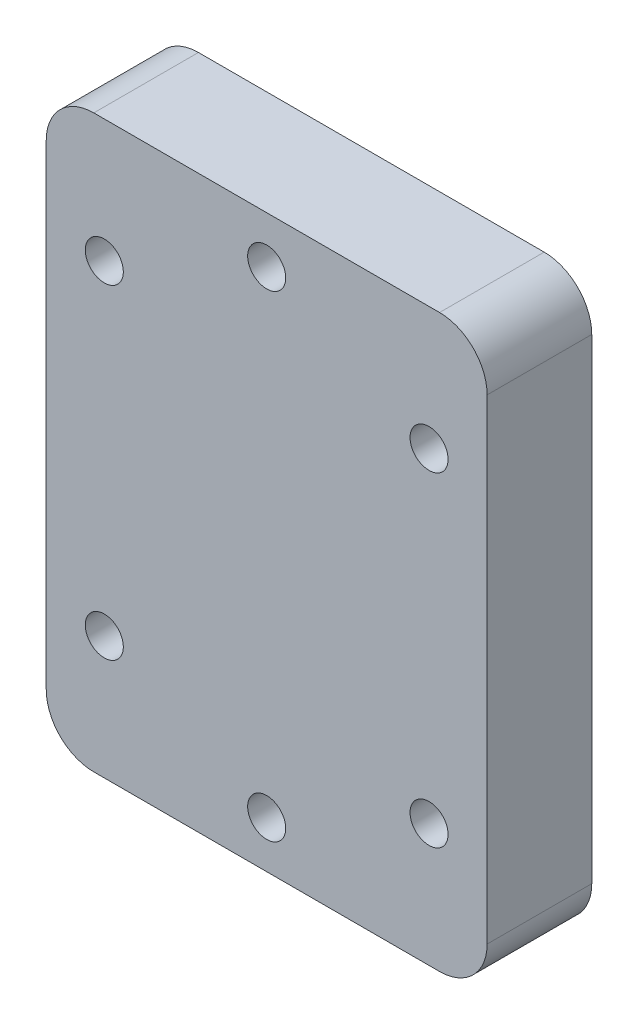
ISO-10303-21;
HEADER;
FILE_DESCRIPTION(('STEP AP214'),'2;1');
FILE_NAME('part.step','',(''),(''),'','','');
FILE_SCHEMA(('AUTOMOTIVE_DESIGN { 1 0 10303 214 1 1 1 1 }'));
ENDSEC;
DATA;
#1=APPLICATION_CONTEXT('core data for automotive mechanical design processes');
#2=APPLICATION_PROTOCOL_DEFINITION('international standard','automotive_design',2000,#1);
#3=PRODUCT_CONTEXT('',#1,'mechanical');
#4=PRODUCT('Part','Part','',(#3));
#5=PRODUCT_RELATED_PRODUCT_CATEGORY('part','',(#4));
#6=PRODUCT_DEFINITION_FORMATION('','',#4);
#7=PRODUCT_DEFINITION_CONTEXT('part definition',#1,'design');
#8=PRODUCT_DEFINITION('design','',#6,#7);
#9=PRODUCT_DEFINITION_SHAPE('','',#8);
#10=(LENGTH_UNIT() NAMED_UNIT(*) SI_UNIT(.MILLI.,.METRE.));
#11=(NAMED_UNIT(*) PLANE_ANGLE_UNIT() SI_UNIT($,.RADIAN.));
#12=(NAMED_UNIT(*) SI_UNIT($,.STERADIAN.) SOLID_ANGLE_UNIT());
#13=UNCERTAINTY_MEASURE_WITH_UNIT(LENGTH_MEASURE(1.E-05),#10,'distance_accuracy_value','');
#14=(GEOMETRIC_REPRESENTATION_CONTEXT(3) GLOBAL_UNCERTAINTY_ASSIGNED_CONTEXT((#13)) GLOBAL_UNIT_ASSIGNED_CONTEXT((#10,
#11,#12)) REPRESENTATION_CONTEXT('',''));
#15=CARTESIAN_POINT('',(0.,0.,0.));
#16=DIRECTION('',(0.,0.,1.));
#17=DIRECTION('',(1.,0.,0.));
#18=AXIS2_PLACEMENT_3D('',#15,#16,#17);
#19=CARTESIAN_POINT('',(-17.0710678118655,-17.0710678118655,2.));
#20=DIRECTION('',(0.,0.,-1.));
#21=DIRECTION('',(-1.,0.,0.));
#22=AXIS2_PLACEMENT_3D('',#19,#20,#21);
#23=CYLINDRICAL_SURFACE('',#22,2.);
#24=CARTESIAN_POINT('',(-17.0710678118655,-17.0710678118655,2.));
#25=DIRECTION('',(0.,0.,1.));
#26=DIRECTION('',(1.,0.,0.));
#27=AXIS2_PLACEMENT_3D('',#24,#25,#26);
#28=CIRCLE('',#27,2.);
#29=CARTESIAN_POINT('',(-15.0710678118655,-17.0710678118655,2.));
#30=VERTEX_POINT('',#29);
#31=EDGE_CURVE('E204',#30,#30,#28,.T.);
#32=ORIENTED_EDGE('',*,*,#31,.T.);
#33=EDGE_LOOP('',(#32));
#34=FACE_BOUND('',#33,.T.);
#35=CARTESIAN_POINT('',(-17.0710678118655,-17.0710678118655,-8.15));
#36=DIRECTION('',(0.,0.,-1.));
#37=DIRECTION('',(-1.,0.,0.));
#38=AXIS2_PLACEMENT_3D('',#35,#36,#37);
#39=CIRCLE('',#38,2.00000000000001);
#40=CARTESIAN_POINT('',(-19.0710678118655,-17.0710678118655,-8.15));
#41=VERTEX_POINT('',#40);
#42=EDGE_CURVE('E387',#41,#41,#39,.T.);
#43=ORIENTED_EDGE('',*,*,#42,.T.);
#44=EDGE_LOOP('',(#43));
#45=FACE_BOUND('',#44,.T.);
#46=ADVANCED_FACE('F47',(#34,#45),#23,.F.);
#47=CARTESIAN_POINT('',(17.0710678118655,-17.0710678118655,2.));
#48=DIRECTION('',(0.,0.,-1.));
#49=DIRECTION('',(-1.,0.,0.));
#50=AXIS2_PLACEMENT_3D('',#47,#48,#49);
#51=CYLINDRICAL_SURFACE('',#50,2.);
#52=CARTESIAN_POINT('',(17.0710678118655,-17.0710678118655,2.));
#53=DIRECTION('',(0.,0.,1.));
#54=DIRECTION('',(1.,0.,0.));
#55=AXIS2_PLACEMENT_3D('',#52,#53,#54);
#56=CIRCLE('',#55,2.);
#57=CARTESIAN_POINT('',(19.0710678118655,-17.0710678118655,2.));
#58=VERTEX_POINT('',#57);
#59=EDGE_CURVE('E207',#58,#58,#56,.T.);
#60=ORIENTED_EDGE('',*,*,#59,.T.);
#61=EDGE_LOOP('',(#60));
#62=FACE_BOUND('',#61,.T.);
#63=CARTESIAN_POINT('',(17.0710678118655,-17.0710678118655,-8.15));
#64=DIRECTION('',(0.,0.,-1.));
#65=DIRECTION('',(-1.,0.,0.));
#66=AXIS2_PLACEMENT_3D('',#63,#64,#65);
#67=CIRCLE('',#66,2.);
#68=CARTESIAN_POINT('',(15.0710678118655,-17.0710678118655,-8.15));
#69=VERTEX_POINT('',#68);
#70=EDGE_CURVE('E383',#69,#69,#67,.T.);
#71=ORIENTED_EDGE('',*,*,#70,.T.);
#72=EDGE_LOOP('',(#71));
#73=FACE_BOUND('',#72,.T.);
#74=ADVANCED_FACE('F299',(#62,#73),#51,.F.);
#75=CARTESIAN_POINT('',(-17.0710678118655,17.0710678118655,2.));
#76=DIRECTION('',(0.,0.,-1.));
#77=DIRECTION('',(-1.,0.,0.));
#78=AXIS2_PLACEMENT_3D('',#75,#76,#77);
#79=CYLINDRICAL_SURFACE('',#78,2.);
#80=CARTESIAN_POINT('',(-17.0710678118655,17.0710678118655,2.));
#81=DIRECTION('',(0.,0.,1.));
#82=DIRECTION('',(1.,0.,0.));
#83=AXIS2_PLACEMENT_3D('',#80,#81,#82);
#84=CIRCLE('',#83,2.);
#85=CARTESIAN_POINT('',(-15.0710678118655,17.0710678118655,2.));
#86=VERTEX_POINT('',#85);
#87=EDGE_CURVE('E201',#86,#86,#84,.T.);
#88=ORIENTED_EDGE('',*,*,#87,.T.);
#89=EDGE_LOOP('',(#88));
#90=FACE_BOUND('',#89,.T.);
#91=CARTESIAN_POINT('',(-17.0710678118655,17.0710678118655,-8.15));
#92=DIRECTION('',(0.,0.,-1.));
#93=DIRECTION('',(-1.,0.,0.));
#94=AXIS2_PLACEMENT_3D('',#91,#92,#93);
#95=CIRCLE('',#94,2.);
#96=CARTESIAN_POINT('',(-19.0710678118655,17.0710678118655,-8.15));
#97=VERTEX_POINT('',#96);
#98=EDGE_CURVE('E381',#97,#97,#95,.T.);
#99=ORIENTED_EDGE('',*,*,#98,.T.);
#100=EDGE_LOOP('',(#99));
#101=FACE_BOUND('',#100,.T.);
#102=ADVANCED_FACE('F306',(#90,#101),#79,.F.);
#103=CARTESIAN_POINT('',(17.0710678118655,17.0710678118655,2.));
#104=DIRECTION('',(0.,0.,-1.));
#105=DIRECTION('',(-1.,0.,0.));
#106=AXIS2_PLACEMENT_3D('',#103,#104,#105);
#107=CYLINDRICAL_SURFACE('',#106,2.);
#108=CARTESIAN_POINT('',(17.0710678118655,17.0710678118655,2.));
#109=DIRECTION('',(0.,0.,1.));
#110=DIRECTION('',(1.,0.,0.));
#111=AXIS2_PLACEMENT_3D('',#108,#109,#110);
#112=CIRCLE('',#111,2.);
#113=CARTESIAN_POINT('',(19.0710678118655,17.0710678118655,2.));
#114=VERTEX_POINT('',#113);
#115=EDGE_CURVE('E210',#114,#114,#112,.T.);
#116=ORIENTED_EDGE('',*,*,#115,.T.);
#117=EDGE_LOOP('',(#116));
#118=FACE_BOUND('',#117,.T.);
#119=CARTESIAN_POINT('',(17.0710678118655,17.0710678118655,-8.15));
#120=DIRECTION('',(0.,0.,-1.));
#121=DIRECTION('',(-1.,0.,0.));
#122=AXIS2_PLACEMENT_3D('',#119,#120,#121);
#123=CIRCLE('',#122,2.);
#124=CARTESIAN_POINT('',(15.0710678118655,17.0710678118655,-8.15));
#125=VERTEX_POINT('',#124);
#126=EDGE_CURVE('E168',#125,#125,#123,.T.);
#127=ORIENTED_EDGE('',*,*,#126,.T.);
#128=EDGE_LOOP('',(#127));
#129=FACE_BOUND('',#128,.T.);
#130=ADVANCED_FACE('F314',(#118,#129),#107,.F.);
#131=CARTESIAN_POINT('',(0.,-30.,2.));
#132=DIRECTION('',(0.,1.,0.));
#133=DIRECTION('',(-1.,0.,0.));
#134=AXIS2_PLACEMENT_3D('',#131,#132,#133);
#135=PLANE('',#134);
#136=DIRECTION('',(1.,0.,0.));
#137=VECTOR('',#136,1.);
#138=CARTESIAN_POINT('',(0.,-30.,2.));
#139=LINE('',#138,#137);
#140=CARTESIAN_POINT('',(-18.175,-30.,2.));
#141=VERTEX_POINT('',#140);
#142=CARTESIAN_POINT('',(18.175,-30.,2.));
#143=VERTEX_POINT('',#142);
#144=EDGE_CURVE('E213',#141,#143,#139,.T.);
#145=ORIENTED_EDGE('',*,*,#144,.F.);
#146=DIRECTION('',(0.,0.,-1.));
#147=VECTOR('',#146,1.);
#148=CARTESIAN_POINT('',(-18.175,-30.,-9.));
#149=LINE('',#148,#147);
#150=CARTESIAN_POINT('',(-18.175,-30.,-9.));
#151=VERTEX_POINT('',#150);
#152=EDGE_CURVE('E11',#141,#151,#149,.T.);
#153=ORIENTED_EDGE('',*,*,#152,.T.);
#154=DIRECTION('',(1.,0.,0.));
#155=VECTOR('',#154,1.);
#156=CARTESIAN_POINT('',(0.,-30.,-9.));
#157=LINE('',#156,#155);
#158=CARTESIAN_POINT('',(18.175,-30.,-9.));
#159=VERTEX_POINT('',#158);
#160=EDGE_CURVE('E180',#151,#159,#157,.T.);
#161=ORIENTED_EDGE('',*,*,#160,.T.);
#162=DIRECTION('',(0.,0.,-1.));
#163=VECTOR('',#162,1.);
#164=CARTESIAN_POINT('',(18.175,-30.,2.));
#165=LINE('',#164,#163);
#166=EDGE_CURVE('E55',#159,#143,#165,.F.);
#167=ORIENTED_EDGE('',*,*,#166,.T.);
#168=EDGE_LOOP('',(#145,#153,#161,#167));
#169=FACE_BOUND('',#168,.T.);
#170=ADVANCED_FACE('F261',(#169),#135,.F.);
#171=CARTESIAN_POINT('',(23.175,0.,2.));
#172=DIRECTION('',(-1.,0.,0.));
#173=DIRECTION('',(0.,0.,1.));
#174=AXIS2_PLACEMENT_3D('',#171,#172,#173);
#175=PLANE('',#174);
#176=DIRECTION('',(0.,1.,0.));
#177=VECTOR('',#176,1.);
#178=CARTESIAN_POINT('',(23.175,0.,-9.));
#179=LINE('',#178,#177);
#180=CARTESIAN_POINT('',(23.175,-25.,-9.));
#181=VERTEX_POINT('',#180);
#182=CARTESIAN_POINT('',(23.175,25.,-9.));
#183=VERTEX_POINT('',#182);
#184=EDGE_CURVE('E186',#181,#183,#179,.T.);
#185=ORIENTED_EDGE('',*,*,#184,.T.);
#186=DIRECTION('',(0.,0.,-1.));
#187=VECTOR('',#186,1.);
#188=CARTESIAN_POINT('',(23.175,25.,2.));
#189=LINE('',#188,#187);
#190=CARTESIAN_POINT('',(23.175,25.,2.));
#191=VERTEX_POINT('',#190);
#192=EDGE_CURVE('E246',#183,#191,#189,.F.);
#193=ORIENTED_EDGE('',*,*,#192,.T.);
#194=DIRECTION('',(0.,1.,0.));
#195=VECTOR('',#194,1.);
#196=CARTESIAN_POINT('',(23.175,0.,2.));
#197=LINE('',#196,#195);
#198=CARTESIAN_POINT('',(23.175,-25.,2.));
#199=VERTEX_POINT('',#198);
#200=EDGE_CURVE('E216',#199,#191,#197,.T.);
#201=ORIENTED_EDGE('',*,*,#200,.F.);
#202=DIRECTION('',(0.,0.,-1.));
#203=VECTOR('',#202,1.);
#204=CARTESIAN_POINT('',(23.175,-25.,2.));
#205=LINE('',#204,#203);
#206=EDGE_CURVE('E243',#199,#181,#205,.T.);
#207=ORIENTED_EDGE('',*,*,#206,.T.);
#208=EDGE_LOOP('',(#185,#193,#201,#207));
#209=FACE_BOUND('',#208,.T.);
#210=ADVANCED_FACE('F273',(#209),#175,.F.);
#211=CARTESIAN_POINT('',(0.,30.,2.));
#212=DIRECTION('',(0.,1.,0.));
#213=DIRECTION('',(-1.,0.,0.));
#214=AXIS2_PLACEMENT_3D('',#211,#212,#213);
#215=PLANE('',#214);
#216=DIRECTION('',(1.,0.,0.));
#217=VECTOR('',#216,1.);
#218=CARTESIAN_POINT('',(0.,30.,2.));
#219=LINE('',#218,#217);
#220=CARTESIAN_POINT('',(-18.175,30.,2.));
#221=VERTEX_POINT('',#220);
#222=CARTESIAN_POINT('',(18.175,30.,2.));
#223=VERTEX_POINT('',#222);
#224=EDGE_CURVE('E219',#221,#223,#219,.T.);
#225=ORIENTED_EDGE('',*,*,#224,.T.);
#226=DIRECTION('',(0.,0.,-1.));
#227=VECTOR('',#226,1.);
#228=CARTESIAN_POINT('',(18.175,30.,-9.));
#229=LINE('',#228,#227);
#230=CARTESIAN_POINT('',(18.175,30.,-9.));
#231=VERTEX_POINT('',#230);
#232=EDGE_CURVE('E232',#223,#231,#229,.T.);
#233=ORIENTED_EDGE('',*,*,#232,.T.);
#234=DIRECTION('',(1.,0.,0.));
#235=VECTOR('',#234,1.);
#236=CARTESIAN_POINT('',(0.,30.,-9.));
#237=LINE('',#236,#235);
#238=CARTESIAN_POINT('',(-18.175,30.,-9.));
#239=VERTEX_POINT('',#238);
#240=EDGE_CURVE('E189',#239,#231,#237,.T.);
#241=ORIENTED_EDGE('',*,*,#240,.F.);
#242=DIRECTION('',(0.,0.,-1.));
#243=VECTOR('',#242,1.);
#244=CARTESIAN_POINT('',(-18.175,30.,2.));
#245=LINE('',#244,#243);
#246=EDGE_CURVE('E230',#239,#221,#245,.F.);
#247=ORIENTED_EDGE('',*,*,#246,.T.);
#248=EDGE_LOOP('',(#225,#233,#241,#247));
#249=FACE_BOUND('',#248,.T.);
#250=ADVANCED_FACE('F284',(#249),#215,.T.);
#251=CARTESIAN_POINT('',(0.,25.060622824795,2.));
#252=DIRECTION('',(0.,0.,-1.));
#253=DIRECTION('',(-1.,0.,0.));
#254=AXIS2_PLACEMENT_3D('',#251,#252,#253);
#255=CYLINDRICAL_SURFACE('',#254,2.);
#256=CARTESIAN_POINT('',(0.,25.060622824795,2.));
#257=DIRECTION('',(0.,0.,1.));
#258=DIRECTION('',(1.,0.,0.));
#259=AXIS2_PLACEMENT_3D('',#256,#257,#258);
#260=CIRCLE('',#259,2.);
#261=CARTESIAN_POINT('',(2.,25.060622824795,2.));
#262=VERTEX_POINT('',#261);
#263=EDGE_CURVE('E224',#262,#262,#260,.T.);
#264=ORIENTED_EDGE('',*,*,#263,.T.);
#265=EDGE_LOOP('',(#264));
#266=FACE_BOUND('',#265,.T.);
#267=CARTESIAN_POINT('',(0.,25.060622824795,-9.));
#268=DIRECTION('',(0.,0.,1.));
#269=DIRECTION('',(1.,0.,0.));
#270=AXIS2_PLACEMENT_3D('',#267,#268,#269);
#271=CIRCLE('',#270,2.);
#272=CARTESIAN_POINT('',(2.,25.060622824795,-9.));
#273=VERTEX_POINT('',#272);
#274=EDGE_CURVE('E195',#273,#273,#271,.T.);
#275=ORIENTED_EDGE('',*,*,#274,.F.);
#276=EDGE_LOOP('',(#275));
#277=FACE_BOUND('',#276,.T.);
#278=ADVANCED_FACE('F363',(#266,#277),#255,.F.);
#279=CARTESIAN_POINT('',(-23.175,0.,2.));
#280=DIRECTION('',(-1.,0.,0.));
#281=DIRECTION('',(0.,0.,1.));
#282=AXIS2_PLACEMENT_3D('',#279,#280,#281);
#283=PLANE('',#282);
#284=DIRECTION('',(0.,1.,0.));
#285=VECTOR('',#284,1.);
#286=CARTESIAN_POINT('',(-23.175,0.,2.));
#287=LINE('',#286,#285);
#288=CARTESIAN_POINT('',(-23.175,-25.,2.));
#289=VERTEX_POINT('',#288);
#290=CARTESIAN_POINT('',(-23.175,25.,2.));
#291=VERTEX_POINT('',#290);
#292=EDGE_CURVE('E222',#289,#291,#287,.T.);
#293=ORIENTED_EDGE('',*,*,#292,.T.);
#294=DIRECTION('',(0.,0.,-1.));
#295=VECTOR('',#294,1.);
#296=CARTESIAN_POINT('',(-23.175,25.,2.));
#297=LINE('',#296,#295);
#298=CARTESIAN_POINT('',(-23.175,25.,-9.));
#299=VERTEX_POINT('',#298);
#300=EDGE_CURVE('E256',#291,#299,#297,.T.);
#301=ORIENTED_EDGE('',*,*,#300,.T.);
#302=DIRECTION('',(0.,1.,0.));
#303=VECTOR('',#302,1.);
#304=CARTESIAN_POINT('',(-23.175,0.,-9.));
#305=LINE('',#304,#303);
#306=CARTESIAN_POINT('',(-23.175,-25.,-9.));
#307=VERTEX_POINT('',#306);
#308=EDGE_CURVE('E192',#307,#299,#305,.T.);
#309=ORIENTED_EDGE('',*,*,#308,.F.);
#310=DIRECTION('',(0.,0.,-1.));
#311=VECTOR('',#310,1.);
#312=CARTESIAN_POINT('',(-23.175,-25.,2.));
#313=LINE('',#312,#311);
#314=EDGE_CURVE('E69',#307,#289,#313,.F.);
#315=ORIENTED_EDGE('',*,*,#314,.T.);
#316=EDGE_LOOP('',(#293,#301,#309,#315));
#317=FACE_BOUND('',#316,.T.);
#318=ADVANCED_FACE('F289',(#317),#283,.T.);
#319=CARTESIAN_POINT('',(0.,-25.060622824795,2.));
#320=DIRECTION('',(0.,0.,-1.));
#321=DIRECTION('',(-1.,0.,0.));
#322=AXIS2_PLACEMENT_3D('',#319,#320,#321);
#323=CYLINDRICAL_SURFACE('',#322,2.);
#324=CARTESIAN_POINT('',(0.,-25.060622824795,2.));
#325=DIRECTION('',(0.,0.,1.));
#326=DIRECTION('',(1.,0.,0.));
#327=AXIS2_PLACEMENT_3D('',#324,#325,#326);
#328=CIRCLE('',#327,2.);
#329=CARTESIAN_POINT('',(2.,-25.060622824795,2.));
#330=VERTEX_POINT('',#329);
#331=EDGE_CURVE('E227',#330,#330,#328,.F.);
#332=ORIENTED_EDGE('',*,*,#331,.F.);
#333=EDGE_LOOP('',(#332));
#334=FACE_BOUND('',#333,.T.);
#335=CARTESIAN_POINT('',(0.,-25.060622824795,-9.));
#336=DIRECTION('',(0.,0.,1.));
#337=DIRECTION('',(1.,0.,0.));
#338=AXIS2_PLACEMENT_3D('',#335,#336,#337);
#339=CIRCLE('',#338,2.);
#340=CARTESIAN_POINT('',(2.,-25.060622824795,-9.));
#341=VERTEX_POINT('',#340);
#342=EDGE_CURVE('E198',#341,#341,#339,.F.);
#343=ORIENTED_EDGE('',*,*,#342,.T.);
#344=EDGE_LOOP('',(#343));
#345=FACE_BOUND('',#344,.T.);
#346=ADVANCED_FACE('F358',(#334,#345),#323,.F.);
#347=CARTESIAN_POINT('',(0.,0.,2.));
#348=DIRECTION('',(0.,0.,1.));
#349=DIRECTION('',(1.,0.,0.));
#350=AXIS2_PLACEMENT_3D('',#347,#348,#349);
#351=PLANE('',#350);
#352=ORIENTED_EDGE('',*,*,#87,.F.);
#353=EDGE_LOOP('',(#352));
#354=FACE_BOUND('',#353,.T.);
#355=ORIENTED_EDGE('',*,*,#31,.F.);
#356=EDGE_LOOP('',(#355));
#357=FACE_BOUND('',#356,.T.);
#358=ORIENTED_EDGE('',*,*,#59,.F.);
#359=EDGE_LOOP('',(#358));
#360=FACE_BOUND('',#359,.T.);
#361=ORIENTED_EDGE('',*,*,#115,.F.);
#362=EDGE_LOOP('',(#361));
#363=FACE_BOUND('',#362,.T.);
#364=ORIENTED_EDGE('',*,*,#200,.T.);
#365=CARTESIAN_POINT('',(18.175,25.,2.));
#366=DIRECTION('',(0.,0.,1.));
#367=DIRECTION('',(1.,0.,0.));
#368=AXIS2_PLACEMENT_3D('',#365,#366,#367);
#369=CIRCLE('',#368,5.);
#370=EDGE_CURVE('E253',#191,#223,#369,.T.);
#371=ORIENTED_EDGE('',*,*,#370,.T.);
#372=ORIENTED_EDGE('',*,*,#224,.F.);
#373=CARTESIAN_POINT('',(-18.175,25.,2.));
#374=DIRECTION('',(0.,0.,1.));
#375=DIRECTION('',(1.,0.,0.));
#376=AXIS2_PLACEMENT_3D('',#373,#374,#375);
#377=CIRCLE('',#376,5.);
#378=EDGE_CURVE('E62',#221,#291,#377,.T.);
#379=ORIENTED_EDGE('',*,*,#378,.T.);
#380=ORIENTED_EDGE('',*,*,#292,.F.);
#381=CARTESIAN_POINT('',(-18.175,-25.,2.));
#382=DIRECTION('',(0.,0.,1.));
#383=DIRECTION('',(1.,0.,0.));
#384=AXIS2_PLACEMENT_3D('',#381,#382,#383);
#385=CIRCLE('',#384,5.);
#386=EDGE_CURVE('E250',#289,#141,#385,.T.);
#387=ORIENTED_EDGE('',*,*,#386,.T.);
#388=ORIENTED_EDGE('',*,*,#144,.T.);
#389=CARTESIAN_POINT('',(18.175,-25.,2.));
#390=DIRECTION('',(0.,0.,1.));
#391=DIRECTION('',(1.,0.,0.));
#392=AXIS2_PLACEMENT_3D('',#389,#390,#391);
#393=CIRCLE('',#392,5.);
#394=EDGE_CURVE('E248',#143,#199,#393,.T.);
#395=ORIENTED_EDGE('',*,*,#394,.T.);
#396=EDGE_LOOP('',(#364,#371,#372,#379,#380,#387,#388,#395));
#397=FACE_BOUND('',#396,.T.);
#398=ORIENTED_EDGE('',*,*,#263,.F.);
#399=EDGE_LOOP('',(#398));
#400=FACE_BOUND('',#399,.T.);
#401=ORIENTED_EDGE('',*,*,#331,.T.);
#402=EDGE_LOOP('',(#401));
#403=FACE_BOUND('',#402,.T.);
#404=ADVANCED_FACE('F266',(#354,#357,#360,#363,#397,#400,#403),#351,.T.);
#405=CARTESIAN_POINT('',(0.,0.,-9.));
#406=DIRECTION('',(0.,0.,1.));
#407=DIRECTION('',(1.,0.,0.));
#408=AXIS2_PLACEMENT_3D('',#405,#406,#407);
#409=PLANE('',#408);
#410=DIRECTION('',(1.,0.,0.));
#411=VECTOR('',#410,1.);
#412=CARTESIAN_POINT('',(15.,15.,-9.));
#413=LINE('',#412,#411);
#414=CARTESIAN_POINT('',(-15.,15.,-9.));
#415=VERTEX_POINT('',#414);
#416=CARTESIAN_POINT('',(15.,15.,-9.));
#417=VERTEX_POINT('',#416);
#418=EDGE_CURVE('E174',#415,#417,#413,.T.);
#419=ORIENTED_EDGE('',*,*,#418,.F.);
#420=DIRECTION('',(0.,1.,0.));
#421=VECTOR('',#420,1.);
#422=CARTESIAN_POINT('',(-15.,-15.,-9.));
#423=LINE('',#422,#421);
#424=CARTESIAN_POINT('',(-15.,-15.,-9.));
#425=VERTEX_POINT('',#424);
#426=EDGE_CURVE('E145',#425,#415,#423,.T.);
#427=ORIENTED_EDGE('',*,*,#426,.F.);
#428=DIRECTION('',(-1.,0.,0.));
#429=VECTOR('',#428,1.);
#430=CARTESIAN_POINT('',(15.,-15.,-9.));
#431=LINE('',#430,#429);
#432=CARTESIAN_POINT('',(15.,-15.,-9.));
#433=VERTEX_POINT('',#432);
#434=EDGE_CURVE('E162',#433,#425,#431,.T.);
#435=ORIENTED_EDGE('',*,*,#434,.F.);
#436=DIRECTION('',(0.,-1.,0.));
#437=VECTOR('',#436,1.);
#438=CARTESIAN_POINT('',(15.,-15.,-9.));
#439=LINE('',#438,#437);
#440=EDGE_CURVE('E165',#417,#433,#439,.T.);
#441=ORIENTED_EDGE('',*,*,#440,.F.);
#442=EDGE_LOOP('',(#419,#427,#435,#441));
#443=FACE_BOUND('',#442,.T.);
#444=ORIENTED_EDGE('',*,*,#240,.T.);
#445=CARTESIAN_POINT('',(18.175,25.,-9.));
#446=DIRECTION('',(0.,0.,1.));
#447=DIRECTION('',(1.,0.,0.));
#448=AXIS2_PLACEMENT_3D('',#445,#446,#447);
#449=CIRCLE('',#448,5.);
#450=EDGE_CURVE('E241',#231,#183,#449,.F.);
#451=ORIENTED_EDGE('',*,*,#450,.T.);
#452=ORIENTED_EDGE('',*,*,#184,.F.);
#453=CARTESIAN_POINT('',(18.175,-25.,-9.));
#454=DIRECTION('',(0.,0.,1.));
#455=DIRECTION('',(1.,0.,0.));
#456=AXIS2_PLACEMENT_3D('',#453,#454,#455);
#457=CIRCLE('',#456,5.);
#458=EDGE_CURVE('E235',#181,#159,#457,.F.);
#459=ORIENTED_EDGE('',*,*,#458,.T.);
#460=ORIENTED_EDGE('',*,*,#160,.F.);
#461=CARTESIAN_POINT('',(-18.175,-25.,-9.));
#462=DIRECTION('',(0.,0.,1.));
#463=DIRECTION('',(1.,0.,0.));
#464=AXIS2_PLACEMENT_3D('',#461,#462,#463);
#465=CIRCLE('',#464,5.);
#466=EDGE_CURVE('E237',#151,#307,#465,.F.);
#467=ORIENTED_EDGE('',*,*,#466,.T.);
#468=ORIENTED_EDGE('',*,*,#308,.T.);
#469=CARTESIAN_POINT('',(-18.175,25.,-9.));
#470=DIRECTION('',(0.,0.,1.));
#471=DIRECTION('',(1.,0.,0.));
#472=AXIS2_PLACEMENT_3D('',#469,#470,#471);
#473=CIRCLE('',#472,5.);
#474=EDGE_CURVE('E239',#299,#239,#473,.F.);
#475=ORIENTED_EDGE('',*,*,#474,.T.);
#476=EDGE_LOOP('',(#444,#451,#452,#459,#460,#467,#468,#475));
#477=FACE_BOUND('',#476,.T.);
#478=ORIENTED_EDGE('',*,*,#274,.T.);
#479=EDGE_LOOP('',(#478));
#480=FACE_BOUND('',#479,.T.);
#481=ORIENTED_EDGE('',*,*,#342,.F.);
#482=EDGE_LOOP('',(#481));
#483=FACE_BOUND('',#482,.T.);
#484=ADVANCED_FACE('F276',(#443,#477,#480,#483),#409,.F.);
#485=CARTESIAN_POINT('',(-15.,-15.,-2.65));
#486=DIRECTION('',(-1.,0.,0.));
#487=DIRECTION('',(0.,0.,1.));
#488=AXIS2_PLACEMENT_3D('',#485,#486,#487);
#489=PLANE('',#488);
#490=ORIENTED_EDGE('',*,*,#426,.T.);
#491=DIRECTION('',(0.,0.,-1.));
#492=VECTOR('',#491,1.);
#493=CARTESIAN_POINT('',(-15.,15.,-2.65));
#494=LINE('',#493,#492);
#495=CARTESIAN_POINT('',(-15.,15.,-2.65));
#496=VERTEX_POINT('',#495);
#497=EDGE_CURVE('E138',#496,#415,#494,.T.);
#498=ORIENTED_EDGE('',*,*,#497,.F.);
#499=DIRECTION('',(0.,1.,0.));
#500=VECTOR('',#499,1.);
#501=CARTESIAN_POINT('',(-15.,-15.,-2.65));
#502=LINE('',#501,#500);
#503=CARTESIAN_POINT('',(-15.,-15.,-2.65));
#504=VERTEX_POINT('',#503);
#505=EDGE_CURVE('E142',#504,#496,#502,.T.);
#506=ORIENTED_EDGE('',*,*,#505,.F.);
#507=DIRECTION('',(0.,0.,-1.));
#508=VECTOR('',#507,1.);
#509=CARTESIAN_POINT('',(-15.,-15.,-2.65));
#510=LINE('',#509,#508);
#511=EDGE_CURVE('E178',#504,#425,#510,.T.);
#512=ORIENTED_EDGE('',*,*,#511,.T.);
#513=EDGE_LOOP('',(#490,#498,#506,#512));
#514=FACE_BOUND('',#513,.T.);
#515=ADVANCED_FACE('F140',(#514),#489,.F.);
#516=CARTESIAN_POINT('',(15.,-15.,-2.65));
#517=DIRECTION('',(0.,-1.,0.));
#518=DIRECTION('',(0.,0.,-1.));
#519=AXIS2_PLACEMENT_3D('',#516,#517,#518);
#520=PLANE('',#519);
#521=ORIENTED_EDGE('',*,*,#434,.T.);
#522=ORIENTED_EDGE('',*,*,#511,.F.);
#523=DIRECTION('',(-1.,0.,0.));
#524=VECTOR('',#523,1.);
#525=CARTESIAN_POINT('',(15.,-15.,-2.65));
#526=LINE('',#525,#524);
#527=CARTESIAN_POINT('',(15.,-15.,-2.65));
#528=VERTEX_POINT('',#527);
#529=EDGE_CURVE('E150',#528,#504,#526,.T.);
#530=ORIENTED_EDGE('',*,*,#529,.F.);
#531=DIRECTION('',(0.,0.,-1.));
#532=VECTOR('',#531,1.);
#533=CARTESIAN_POINT('',(15.,-15.,-2.65));
#534=LINE('',#533,#532);
#535=EDGE_CURVE('E181',#528,#433,#534,.T.);
#536=ORIENTED_EDGE('',*,*,#535,.T.);
#537=EDGE_LOOP('',(#521,#522,#530,#536));
#538=FACE_BOUND('',#537,.T.);
#539=ADVANCED_FACE('F342',(#538),#520,.F.);
#540=CARTESIAN_POINT('',(15.,-15.,-2.65));
#541=DIRECTION('',(1.,0.,0.));
#542=DIRECTION('',(0.,0.,-1.));
#543=AXIS2_PLACEMENT_3D('',#540,#541,#542);
#544=PLANE('',#543);
#545=ORIENTED_EDGE('',*,*,#440,.T.);
#546=ORIENTED_EDGE('',*,*,#535,.F.);
#547=DIRECTION('',(0.,-1.,0.));
#548=VECTOR('',#547,1.);
#549=CARTESIAN_POINT('',(15.,-15.,-2.65));
#550=LINE('',#549,#548);
#551=CARTESIAN_POINT('',(15.,15.,-2.65));
#552=VERTEX_POINT('',#551);
#553=EDGE_CURVE('E158',#552,#528,#550,.T.);
#554=ORIENTED_EDGE('',*,*,#553,.F.);
#555=DIRECTION('',(0.,0.,-1.));
#556=VECTOR('',#555,1.);
#557=CARTESIAN_POINT('',(15.,15.,-2.65));
#558=LINE('',#557,#556);
#559=EDGE_CURVE('E149',#552,#417,#558,.T.);
#560=ORIENTED_EDGE('',*,*,#559,.T.);
#561=EDGE_LOOP('',(#545,#546,#554,#560));
#562=FACE_BOUND('',#561,.T.);
#563=ADVANCED_FACE('F345',(#562),#544,.F.);
#564=CARTESIAN_POINT('',(15.,15.,-2.65));
#565=DIRECTION('',(0.,1.,0.));
#566=DIRECTION('',(0.,0.,1.));
#567=AXIS2_PLACEMENT_3D('',#564,#565,#566);
#568=PLANE('',#567);
#569=ORIENTED_EDGE('',*,*,#418,.T.);
#570=ORIENTED_EDGE('',*,*,#559,.F.);
#571=DIRECTION('',(1.,0.,0.));
#572=VECTOR('',#571,1.);
#573=CARTESIAN_POINT('',(15.,15.,-2.65));
#574=LINE('',#573,#572);
#575=EDGE_CURVE('E153',#496,#552,#574,.T.);
#576=ORIENTED_EDGE('',*,*,#575,.F.);
#577=ORIENTED_EDGE('',*,*,#497,.T.);
#578=EDGE_LOOP('',(#569,#570,#576,#577));
#579=FACE_BOUND('',#578,.T.);
#580=ADVANCED_FACE('F154',(#579),#568,.F.);
#581=CARTESIAN_POINT('',(0.,0.,-2.65));
#582=DIRECTION('',(0.,0.,1.));
#583=DIRECTION('',(1.,0.,0.));
#584=AXIS2_PLACEMENT_3D('',#581,#582,#583);
#585=PLANE('',#584);
#586=ORIENTED_EDGE('',*,*,#505,.T.);
#587=ORIENTED_EDGE('',*,*,#575,.T.);
#588=ORIENTED_EDGE('',*,*,#553,.T.);
#589=ORIENTED_EDGE('',*,*,#529,.T.);
#590=EDGE_LOOP('',(#586,#587,#588,#589));
#591=FACE_BOUND('',#590,.T.);
#592=ADVANCED_FACE('F160',(#591),#585,.F.);
#593=CARTESIAN_POINT('',(17.0710678118655,17.0710678118655,-8.15));
#594=DIRECTION('',(0.,0.,-1.));
#595=DIRECTION('',(-1.,0.,0.));
#596=AXIS2_PLACEMENT_3D('',#593,#594,#595);
#597=PLANE('',#596);
#598=ORIENTED_EDGE('',*,*,#126,.F.);
#599=EDGE_LOOP('',(#598));
#600=FACE_BOUND('',#599,.T.);
#601=ADVANCED_FACE('F336',(#600),#597,.F.);
#602=CARTESIAN_POINT('',(-17.0710678118655,17.0710678118655,-8.15));
#603=DIRECTION('',(0.,0.,-1.));
#604=DIRECTION('',(-1.,0.,0.));
#605=AXIS2_PLACEMENT_3D('',#602,#603,#604);
#606=PLANE('',#605);
#607=ORIENTED_EDGE('',*,*,#98,.F.);
#608=EDGE_LOOP('',(#607));
#609=FACE_BOUND('',#608,.T.);
#610=ADVANCED_FACE('F329',(#609),#606,.F.);
#611=CARTESIAN_POINT('',(17.0710678118655,-17.0710678118655,-8.15));
#612=DIRECTION('',(0.,0.,-1.));
#613=DIRECTION('',(-1.,0.,0.));
#614=AXIS2_PLACEMENT_3D('',#611,#612,#613);
#615=PLANE('',#614);
#616=ORIENTED_EDGE('',*,*,#70,.F.);
#617=EDGE_LOOP('',(#616));
#618=FACE_BOUND('',#617,.T.);
#619=ADVANCED_FACE('F322',(#618),#615,.F.);
#620=CARTESIAN_POINT('',(-17.0710678118655,-17.0710678118655,-8.15));
#621=DIRECTION('',(0.,0.,-1.));
#622=DIRECTION('',(-1.,0.,0.));
#623=AXIS2_PLACEMENT_3D('',#620,#621,#622);
#624=PLANE('',#623);
#625=ORIENTED_EDGE('',*,*,#42,.F.);
#626=EDGE_LOOP('',(#625));
#627=FACE_BOUND('',#626,.T.);
#628=ADVANCED_FACE('F317',(#627),#624,.F.);
#629=CARTESIAN_POINT('',(18.175,25.,2.));
#630=DIRECTION('',(0.,0.,1.));
#631=DIRECTION('',(1.,0.,0.));
#632=AXIS2_PLACEMENT_3D('',#629,#630,#631);
#633=CYLINDRICAL_SURFACE('',#632,5.);
#634=ORIENTED_EDGE('',*,*,#370,.F.);
#635=ORIENTED_EDGE('',*,*,#192,.F.);
#636=ORIENTED_EDGE('',*,*,#450,.F.);
#637=ORIENTED_EDGE('',*,*,#232,.F.);
#638=EDGE_LOOP('',(#634,#635,#636,#637));
#639=FACE_BOUND('',#638,.T.);
#640=ADVANCED_FACE('F282',(#639),#633,.T.);
#641=CARTESIAN_POINT('',(-18.175,25.,2.));
#642=DIRECTION('',(0.,0.,-1.));
#643=DIRECTION('',(-1.,0.,0.));
#644=AXIS2_PLACEMENT_3D('',#641,#642,#643);
#645=CYLINDRICAL_SURFACE('',#644,5.);
#646=ORIENTED_EDGE('',*,*,#378,.F.);
#647=ORIENTED_EDGE('',*,*,#246,.F.);
#648=ORIENTED_EDGE('',*,*,#474,.F.);
#649=ORIENTED_EDGE('',*,*,#300,.F.);
#650=EDGE_LOOP('',(#646,#647,#648,#649));
#651=FACE_BOUND('',#650,.T.);
#652=ADVANCED_FACE('F288',(#651),#645,.T.);
#653=CARTESIAN_POINT('',(-18.175,-25.,2.));
#654=DIRECTION('',(0.,0.,1.));
#655=DIRECTION('',(1.,0.,0.));
#656=AXIS2_PLACEMENT_3D('',#653,#654,#655);
#657=CYLINDRICAL_SURFACE('',#656,5.);
#658=ORIENTED_EDGE('',*,*,#386,.F.);
#659=ORIENTED_EDGE('',*,*,#314,.F.);
#660=ORIENTED_EDGE('',*,*,#466,.F.);
#661=ORIENTED_EDGE('',*,*,#152,.F.);
#662=EDGE_LOOP('',(#658,#659,#660,#661));
#663=FACE_BOUND('',#662,.T.);
#664=ADVANCED_FACE('F291',(#663),#657,.T.);
#665=CARTESIAN_POINT('',(18.175,-25.,2.));
#666=DIRECTION('',(0.,0.,-1.));
#667=DIRECTION('',(-1.,0.,0.));
#668=AXIS2_PLACEMENT_3D('',#665,#666,#667);
#669=CYLINDRICAL_SURFACE('',#668,5.);
#670=ORIENTED_EDGE('',*,*,#394,.F.);
#671=ORIENTED_EDGE('',*,*,#166,.F.);
#672=ORIENTED_EDGE('',*,*,#458,.F.);
#673=ORIENTED_EDGE('',*,*,#206,.F.);
#674=EDGE_LOOP('',(#670,#671,#672,#673));
#675=FACE_BOUND('',#674,.T.);
#676=ADVANCED_FACE('F49',(#675),#669,.T.);
#677=CLOSED_SHELL('',(#46,#74,#102,#130,#170,#210,#250,#278,#318,#346,#404,#484,#515,#539,#563,
#580,#592,#601,#610,#619,#628,#640,#652,#664,#676));
#678=MANIFOLD_SOLID_BREP('B2',#677);
#679=ADVANCED_BREP_SHAPE_REPRESENTATION('',(#18,#678),#14);
#680=SHAPE_DEFINITION_REPRESENTATION(#9,#679);
ENDSEC;
END-ISO-10303-21;
